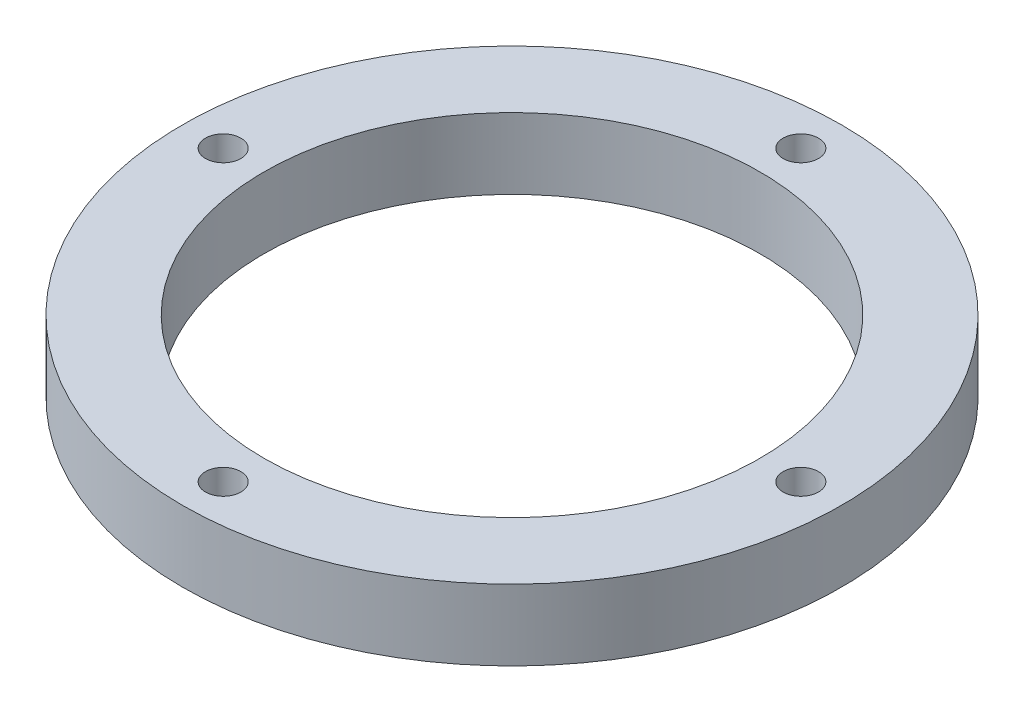
ISO-10303-21;
HEADER;
FILE_DESCRIPTION(('STEP AP214'),'2;1');
FILE_NAME('part.step','',(''),(''),'','','');
FILE_SCHEMA(('AUTOMOTIVE_DESIGN { 1 0 10303 214 1 1 1 1 }'));
ENDSEC;
DATA;
#1=APPLICATION_CONTEXT('core data for automotive mechanical design processes');
#2=APPLICATION_PROTOCOL_DEFINITION('international standard','automotive_design',2000,#1);
#3=PRODUCT_CONTEXT('',#1,'mechanical');
#4=PRODUCT('Part','Part','',(#3));
#5=PRODUCT_RELATED_PRODUCT_CATEGORY('part','',(#4));
#6=PRODUCT_DEFINITION_FORMATION('','',#4);
#7=PRODUCT_DEFINITION_CONTEXT('part definition',#1,'design');
#8=PRODUCT_DEFINITION('design','',#6,#7);
#9=PRODUCT_DEFINITION_SHAPE('','',#8);
#10=(LENGTH_UNIT() NAMED_UNIT(*) SI_UNIT(.MILLI.,.METRE.));
#11=(NAMED_UNIT(*) PLANE_ANGLE_UNIT() SI_UNIT($,.RADIAN.));
#12=(NAMED_UNIT(*) SI_UNIT($,.STERADIAN.) SOLID_ANGLE_UNIT());
#13=UNCERTAINTY_MEASURE_WITH_UNIT(LENGTH_MEASURE(1.E-05),#10,'distance_accuracy_value','');
#14=(GEOMETRIC_REPRESENTATION_CONTEXT(3) GLOBAL_UNCERTAINTY_ASSIGNED_CONTEXT((#13)) GLOBAL_UNIT_ASSIGNED_CONTEXT((#10,
#11,#12)) REPRESENTATION_CONTEXT('',''));
#15=CARTESIAN_POINT('',(0.,0.,0.));
#16=DIRECTION('',(0.,0.,1.));
#17=DIRECTION('',(1.,0.,0.));
#18=AXIS2_PLACEMENT_3D('',#15,#16,#17);
#19=CARTESIAN_POINT('',(0.,10.,0.));
#20=DIRECTION('',(0.,1.,0.));
#21=DIRECTION('',(0.,0.,1.));
#22=AXIS2_PLACEMENT_3D('',#19,#20,#21);
#23=PLANE('',#22);
#24=CARTESIAN_POINT('',(40.75,10.,0.));
#25=DIRECTION('',(0.,1.,0.));
#26=DIRECTION('',(0.,0.,1.));
#27=AXIS2_PLACEMENT_3D('',#24,#25,#26);
#28=CIRCLE('',#27,2.5);
#29=CARTESIAN_POINT('',(40.75,10.,2.5));
#30=VERTEX_POINT('',#29);
#31=EDGE_CURVE('E64',#30,#30,#28,.T.);
#32=ORIENTED_EDGE('',*,*,#31,.F.);
#33=EDGE_LOOP('',(#32));
#34=FACE_BOUND('',#33,.T.);
#35=CARTESIAN_POINT('',(-40.75,10.,0.));
#36=DIRECTION('',(0.,1.,0.));
#37=DIRECTION('',(0.,0.,1.));
#38=AXIS2_PLACEMENT_3D('',#35,#36,#37);
#39=CIRCLE('',#38,2.5);
#40=CARTESIAN_POINT('',(-40.75,10.,2.5));
#41=VERTEX_POINT('',#40);
#42=EDGE_CURVE('E52',#41,#41,#39,.T.);
#43=ORIENTED_EDGE('',*,*,#42,.F.);
#44=EDGE_LOOP('',(#43));
#45=FACE_BOUND('',#44,.T.);
#46=CARTESIAN_POINT('',(0.,10.,0.));
#47=DIRECTION('',(0.,1.,0.));
#48=DIRECTION('',(0.,0.,1.));
#49=AXIS2_PLACEMENT_3D('',#46,#47,#48);
#50=CIRCLE('',#49,46.5);
#51=CARTESIAN_POINT('',(0.,10.,46.5));
#52=VERTEX_POINT('',#51);
#53=EDGE_CURVE('E10',#52,#52,#50,.T.);
#54=ORIENTED_EDGE('',*,*,#53,.T.);
#55=EDGE_LOOP('',(#54));
#56=FACE_BOUND('',#55,.T.);
#57=CARTESIAN_POINT('',(0.,10.,0.));
#58=DIRECTION('',(0.,1.,0.));
#59=DIRECTION('',(0.,0.,1.));
#60=AXIS2_PLACEMENT_3D('',#57,#58,#59);
#61=CIRCLE('',#60,35.);
#62=CARTESIAN_POINT('',(0.,10.,35.));
#63=VERTEX_POINT('',#62);
#64=EDGE_CURVE('E47',#63,#63,#61,.T.);
#65=ORIENTED_EDGE('',*,*,#64,.F.);
#66=EDGE_LOOP('',(#65));
#67=FACE_BOUND('',#66,.T.);
#68=CARTESIAN_POINT('',(0.,10.,-40.75));
#69=DIRECTION('',(0.,1.,0.));
#70=DIRECTION('',(0.,0.,1.));
#71=AXIS2_PLACEMENT_3D('',#68,#69,#70);
#72=CIRCLE('',#71,2.5);
#73=CARTESIAN_POINT('',(0.,10.,-38.25));
#74=VERTEX_POINT('',#73);
#75=EDGE_CURVE('E58',#74,#74,#72,.T.);
#76=ORIENTED_EDGE('',*,*,#75,.F.);
#77=EDGE_LOOP('',(#76));
#78=FACE_BOUND('',#77,.T.);
#79=CARTESIAN_POINT('',(0.,10.,40.75));
#80=DIRECTION('',(0.,1.,0.));
#81=DIRECTION('',(0.,0.,1.));
#82=AXIS2_PLACEMENT_3D('',#79,#80,#81);
#83=CIRCLE('',#82,2.5);
#84=CARTESIAN_POINT('',(0.,10.,43.25));
#85=VERTEX_POINT('',#84);
#86=EDGE_CURVE('E70',#85,#85,#83,.T.);
#87=ORIENTED_EDGE('',*,*,#86,.F.);
#88=EDGE_LOOP('',(#87));
#89=FACE_BOUND('',#88,.T.);
#90=ADVANCED_FACE('F36',(#34,#45,#56,#67,#78,#89),#23,.T.);
#91=CARTESIAN_POINT('',(0.,0.,0.));
#92=DIRECTION('',(0.,1.,0.));
#93=DIRECTION('',(0.,0.,1.));
#94=AXIS2_PLACEMENT_3D('',#91,#92,#93);
#95=PLANE('',#94);
#96=CARTESIAN_POINT('',(0.,0.,0.));
#97=DIRECTION('',(0.,1.,0.));
#98=DIRECTION('',(0.,0.,1.));
#99=AXIS2_PLACEMENT_3D('',#96,#97,#98);
#100=CIRCLE('',#99,46.5);
#101=CARTESIAN_POINT('',(0.,0.,46.5));
#102=VERTEX_POINT('',#101);
#103=EDGE_CURVE('E40',#102,#102,#100,.T.);
#104=ORIENTED_EDGE('',*,*,#103,.F.);
#105=EDGE_LOOP('',(#104));
#106=FACE_BOUND('',#105,.T.);
#107=CARTESIAN_POINT('',(0.,0.,0.));
#108=DIRECTION('',(0.,1.,0.));
#109=DIRECTION('',(0.,0.,1.));
#110=AXIS2_PLACEMENT_3D('',#107,#108,#109);
#111=CIRCLE('',#110,35.);
#112=CARTESIAN_POINT('',(0.,0.,35.));
#113=VERTEX_POINT('',#112);
#114=EDGE_CURVE('E49',#113,#113,#111,.T.);
#115=ORIENTED_EDGE('',*,*,#114,.T.);
#116=EDGE_LOOP('',(#115));
#117=FACE_BOUND('',#116,.T.);
#118=CARTESIAN_POINT('',(-40.75,0.,0.));
#119=DIRECTION('',(0.,1.,0.));
#120=DIRECTION('',(0.,0.,1.));
#121=AXIS2_PLACEMENT_3D('',#118,#119,#120);
#122=CIRCLE('',#121,2.5);
#123=CARTESIAN_POINT('',(-40.75,0.,2.5));
#124=VERTEX_POINT('',#123);
#125=EDGE_CURVE('E55',#124,#124,#122,.T.);
#126=ORIENTED_EDGE('',*,*,#125,.T.);
#127=EDGE_LOOP('',(#126));
#128=FACE_BOUND('',#127,.T.);
#129=CARTESIAN_POINT('',(0.,0.,-40.75));
#130=DIRECTION('',(0.,1.,0.));
#131=DIRECTION('',(0.,0.,1.));
#132=AXIS2_PLACEMENT_3D('',#129,#130,#131);
#133=CIRCLE('',#132,2.5);
#134=CARTESIAN_POINT('',(0.,0.,-38.25));
#135=VERTEX_POINT('',#134);
#136=EDGE_CURVE('E61',#135,#135,#133,.T.);
#137=ORIENTED_EDGE('',*,*,#136,.T.);
#138=EDGE_LOOP('',(#137));
#139=FACE_BOUND('',#138,.T.);
#140=CARTESIAN_POINT('',(40.75,0.,0.));
#141=DIRECTION('',(0.,1.,0.));
#142=DIRECTION('',(0.,0.,1.));
#143=AXIS2_PLACEMENT_3D('',#140,#141,#142);
#144=CIRCLE('',#143,2.5);
#145=CARTESIAN_POINT('',(40.75,0.,2.5));
#146=VERTEX_POINT('',#145);
#147=EDGE_CURVE('E67',#146,#146,#144,.T.);
#148=ORIENTED_EDGE('',*,*,#147,.T.);
#149=EDGE_LOOP('',(#148));
#150=FACE_BOUND('',#149,.T.);
#151=CARTESIAN_POINT('',(0.,0.,40.75));
#152=DIRECTION('',(0.,1.,0.));
#153=DIRECTION('',(0.,0.,1.));
#154=AXIS2_PLACEMENT_3D('',#151,#152,#153);
#155=CIRCLE('',#154,2.5);
#156=CARTESIAN_POINT('',(0.,0.,43.25));
#157=VERTEX_POINT('',#156);
#158=EDGE_CURVE('E73',#157,#157,#155,.T.);
#159=ORIENTED_EDGE('',*,*,#158,.T.);
#160=EDGE_LOOP('',(#159));
#161=FACE_BOUND('',#160,.T.);
#162=ADVANCED_FACE('F83',(#106,#117,#128,#139,#150,#161),#95,.F.);
#163=CARTESIAN_POINT('',(0.,10.,0.));
#164=DIRECTION('',(0.,-1.,0.));
#165=DIRECTION('',(0.,0.,-1.));
#166=AXIS2_PLACEMENT_3D('',#163,#164,#165);
#167=CYLINDRICAL_SURFACE('',#166,46.5);
#168=ORIENTED_EDGE('',*,*,#53,.F.);
#169=EDGE_LOOP('',(#168));
#170=FACE_BOUND('',#169,.T.);
#171=ORIENTED_EDGE('',*,*,#103,.T.);
#172=EDGE_LOOP('',(#171));
#173=FACE_BOUND('',#172,.T.);
#174=ADVANCED_FACE('F38',(#170,#173),#167,.T.);
#175=CARTESIAN_POINT('',(0.,10.,0.));
#176=DIRECTION('',(0.,-1.,0.));
#177=DIRECTION('',(0.,0.,-1.));
#178=AXIS2_PLACEMENT_3D('',#175,#176,#177);
#179=CYLINDRICAL_SURFACE('',#178,35.);
#180=ORIENTED_EDGE('',*,*,#64,.T.);
#181=EDGE_LOOP('',(#180));
#182=FACE_BOUND('',#181,.T.);
#183=ORIENTED_EDGE('',*,*,#114,.F.);
#184=EDGE_LOOP('',(#183));
#185=FACE_BOUND('',#184,.T.);
#186=ADVANCED_FACE('F93',(#182,#185),#179,.F.);
#187=CARTESIAN_POINT('',(-40.75,10.,0.));
#188=DIRECTION('',(0.,-1.,0.));
#189=DIRECTION('',(0.,0.,-1.));
#190=AXIS2_PLACEMENT_3D('',#187,#188,#189);
#191=CYLINDRICAL_SURFACE('',#190,2.5);
#192=ORIENTED_EDGE('',*,*,#42,.T.);
#193=EDGE_LOOP('',(#192));
#194=FACE_BOUND('',#193,.T.);
#195=ORIENTED_EDGE('',*,*,#125,.F.);
#196=EDGE_LOOP('',(#195));
#197=FACE_BOUND('',#196,.T.);
#198=ADVANCED_FACE('F96',(#194,#197),#191,.F.);
#199=CARTESIAN_POINT('',(0.,10.,-40.75));
#200=DIRECTION('',(0.,-1.,0.));
#201=DIRECTION('',(0.,0.,-1.));
#202=AXIS2_PLACEMENT_3D('',#199,#200,#201);
#203=CYLINDRICAL_SURFACE('',#202,2.5);
#204=ORIENTED_EDGE('',*,*,#75,.T.);
#205=EDGE_LOOP('',(#204));
#206=FACE_BOUND('',#205,.T.);
#207=ORIENTED_EDGE('',*,*,#136,.F.);
#208=EDGE_LOOP('',(#207));
#209=FACE_BOUND('',#208,.T.);
#210=ADVANCED_FACE('F100',(#206,#209),#203,.F.);
#211=CARTESIAN_POINT('',(40.75,10.,0.));
#212=DIRECTION('',(0.,-1.,0.));
#213=DIRECTION('',(0.,0.,-1.));
#214=AXIS2_PLACEMENT_3D('',#211,#212,#213);
#215=CYLINDRICAL_SURFACE('',#214,2.5);
#216=ORIENTED_EDGE('',*,*,#31,.T.);
#217=EDGE_LOOP('',(#216));
#218=FACE_BOUND('',#217,.T.);
#219=ORIENTED_EDGE('',*,*,#147,.F.);
#220=EDGE_LOOP('',(#219));
#221=FACE_BOUND('',#220,.T.);
#222=ADVANCED_FACE('F104',(#218,#221),#215,.F.);
#223=CARTESIAN_POINT('',(0.,10.,40.75));
#224=DIRECTION('',(0.,-1.,0.));
#225=DIRECTION('',(0.,0.,-1.));
#226=AXIS2_PLACEMENT_3D('',#223,#224,#225);
#227=CYLINDRICAL_SURFACE('',#226,2.5);
#228=ORIENTED_EDGE('',*,*,#86,.T.);
#229=EDGE_LOOP('',(#228));
#230=FACE_BOUND('',#229,.T.);
#231=ORIENTED_EDGE('',*,*,#158,.F.);
#232=EDGE_LOOP('',(#231));
#233=FACE_BOUND('',#232,.T.);
#234=ADVANCED_FACE('F79',(#230,#233),#227,.F.);
#235=CLOSED_SHELL('',(#90,#162,#174,#186,#198,#210,#222,#234));
#236=MANIFOLD_SOLID_BREP('B2',#235);
#237=ADVANCED_BREP_SHAPE_REPRESENTATION('',(#18,#236),#14);
#238=SHAPE_DEFINITION_REPRESENTATION(#9,#237);
ENDSEC;
END-ISO-10303-21;
